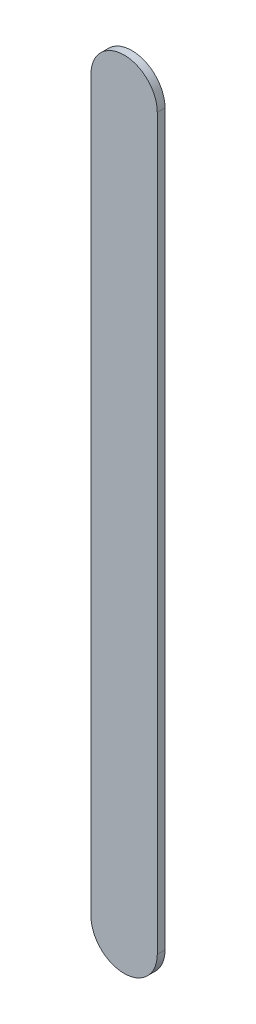
ISO-10303-21;
HEADER;
FILE_DESCRIPTION(('STEP AP214'),'2;1');
FILE_NAME('part.step','',(''),(''),'','','');
FILE_SCHEMA(('AUTOMOTIVE_DESIGN { 1 0 10303 214 1 1 1 1 }'));
ENDSEC;
DATA;
#1=APPLICATION_CONTEXT('core data for automotive mechanical design processes');
#2=APPLICATION_PROTOCOL_DEFINITION('international standard','automotive_design',2000,#1);
#3=PRODUCT_CONTEXT('',#1,'mechanical');
#4=PRODUCT('Part','Part','',(#3));
#5=PRODUCT_RELATED_PRODUCT_CATEGORY('part','',(#4));
#6=PRODUCT_DEFINITION_FORMATION('','',#4);
#7=PRODUCT_DEFINITION_CONTEXT('part definition',#1,'design');
#8=PRODUCT_DEFINITION('design','',#6,#7);
#9=PRODUCT_DEFINITION_SHAPE('','',#8);
#10=(LENGTH_UNIT() NAMED_UNIT(*) SI_UNIT(.MILLI.,.METRE.));
#11=(NAMED_UNIT(*) PLANE_ANGLE_UNIT() SI_UNIT($,.RADIAN.));
#12=(NAMED_UNIT(*) SI_UNIT($,.STERADIAN.) SOLID_ANGLE_UNIT());
#13=UNCERTAINTY_MEASURE_WITH_UNIT(LENGTH_MEASURE(1.E-05),#10,'distance_accuracy_value','');
#14=(GEOMETRIC_REPRESENTATION_CONTEXT(3) GLOBAL_UNCERTAINTY_ASSIGNED_CONTEXT((#13)) GLOBAL_UNIT_ASSIGNED_CONTEXT((#10,
#11,#12)) REPRESENTATION_CONTEXT('',''));
#15=CARTESIAN_POINT('',(0.,0.,0.));
#16=DIRECTION('',(0.,0.,1.));
#17=DIRECTION('',(1.,0.,0.));
#18=AXIS2_PLACEMENT_3D('',#15,#16,#17);
#19=CARTESIAN_POINT('',(96.15,-131.5,1.635));
#20=DIRECTION('',(0.,0.,1.));
#21=DIRECTION('',(1.,0.,0.));
#22=AXIS2_PLACEMENT_3D('',#19,#20,#21);
#23=PLANE('',#22);
#24=DIRECTION('',(0.,-1.,0.));
#25=VECTOR('',#24,1.);
#26=CARTESIAN_POINT('',(96.15,-131.5,1.635));
#27=LINE('',#26,#25);
#28=CARTESIAN_POINT('',(96.15,-131.5,1.635));
#29=VERTEX_POINT('',#28);
#30=CARTESIAN_POINT('',(96.15,-134.8,1.635));
#31=VERTEX_POINT('',#30);
#32=EDGE_CURVE('E92',#29,#31,#27,.T.);
#33=ORIENTED_EDGE('',*,*,#32,.T.);
#34=CARTESIAN_POINT('',(96.3,-134.8,1.635));
#35=DIRECTION('',(0.,0.,1.));
#36=DIRECTION('',(-1.,-1.894780628694E-13,0.));
#37=AXIS2_PLACEMENT_3D('',#34,#35,#36);
#38=CIRCLE('',#37,0.15);
#39=CARTESIAN_POINT('',(96.45,-134.8,1.635));
#40=VERTEX_POINT('',#39);
#41=EDGE_CURVE('E104',#31,#40,#38,.T.);
#42=ORIENTED_EDGE('',*,*,#41,.T.);
#43=DIRECTION('',(0.,1.,0.));
#44=VECTOR('',#43,1.);
#45=CARTESIAN_POINT('',(96.45,-134.8,1.635));
#46=LINE('',#45,#44);
#47=CARTESIAN_POINT('',(96.45,-131.5,1.635));
#48=VERTEX_POINT('',#47);
#49=EDGE_CURVE('E85',#40,#48,#46,.T.);
#50=ORIENTED_EDGE('',*,*,#49,.T.);
#51=CARTESIAN_POINT('',(96.3,-131.5,1.635));
#52=DIRECTION('',(0.,0.,1.));
#53=DIRECTION('',(1.,0.,0.));
#54=AXIS2_PLACEMENT_3D('',#51,#52,#53);
#55=CIRCLE('',#54,0.15);
#56=EDGE_CURVE('E11',#48,#29,#55,.T.);
#57=ORIENTED_EDGE('',*,*,#56,.T.);
#58=EDGE_LOOP('',(#33,#42,#50,#57));
#59=FACE_BOUND('',#58,.T.);
#60=ADVANCED_FACE('F17',(#59),#23,.T.);
#61=CARTESIAN_POINT('',(96.15,-131.5,1.6));
#62=DIRECTION('',(0.,0.,1.));
#63=DIRECTION('',(1.,0.,0.));
#64=AXIS2_PLACEMENT_3D('',#61,#62,#63);
#65=PLANE('',#64);
#66=CARTESIAN_POINT('',(96.3,-131.5,1.6));
#67=DIRECTION('',(0.,0.,1.));
#68=DIRECTION('',(1.,0.,0.));
#69=AXIS2_PLACEMENT_3D('',#66,#67,#68);
#70=CIRCLE('',#69,0.15);
#71=CARTESIAN_POINT('',(96.45,-131.5,1.6));
#72=VERTEX_POINT('',#71);
#73=CARTESIAN_POINT('',(96.15,-131.5,1.6));
#74=VERTEX_POINT('',#73);
#75=EDGE_CURVE('E26',#72,#74,#70,.T.);
#76=ORIENTED_EDGE('',*,*,#75,.F.);
#77=DIRECTION('',(0.,1.,0.));
#78=VECTOR('',#77,1.);
#79=CARTESIAN_POINT('',(96.45,-134.8,1.6));
#80=LINE('',#79,#78);
#81=CARTESIAN_POINT('',(96.45,-134.8,1.6));
#82=VERTEX_POINT('',#81);
#83=EDGE_CURVE('E59',#82,#72,#80,.T.);
#84=ORIENTED_EDGE('',*,*,#83,.F.);
#85=CARTESIAN_POINT('',(96.3,-134.8,1.6));
#86=DIRECTION('',(0.,0.,1.));
#87=DIRECTION('',(-1.,-1.894780628694E-13,0.));
#88=AXIS2_PLACEMENT_3D('',#85,#86,#87);
#89=CIRCLE('',#88,0.15);
#90=CARTESIAN_POINT('',(96.15,-134.8,1.6));
#91=VERTEX_POINT('',#90);
#92=EDGE_CURVE('E74',#91,#82,#89,.T.);
#93=ORIENTED_EDGE('',*,*,#92,.F.);
#94=DIRECTION('',(0.,-1.,0.));
#95=VECTOR('',#94,1.);
#96=CARTESIAN_POINT('',(96.15,-131.5,1.6));
#97=LINE('',#96,#95);
#98=EDGE_CURVE('E91',#74,#91,#97,.T.);
#99=ORIENTED_EDGE('',*,*,#98,.F.);
#100=EDGE_LOOP('',(#76,#84,#93,#99));
#101=FACE_BOUND('',#100,.T.);
#102=ADVANCED_FACE('F19',(#101),#65,.F.);
#103=CARTESIAN_POINT('',(96.3,-131.5,1.6));
#104=DIRECTION('',(0.,0.,-1.));
#105=DIRECTION('',(1.,0.,0.));
#106=AXIS2_PLACEMENT_3D('',#103,#104,#105);
#107=CYLINDRICAL_SURFACE('',#106,0.15);
#108=ORIENTED_EDGE('',*,*,#75,.T.);
#109=DIRECTION('',(0.,0.,1.));
#110=VECTOR('',#109,1.);
#111=CARTESIAN_POINT('',(96.15,-131.5,1.6));
#112=LINE('',#111,#110);
#113=EDGE_CURVE('E80',#74,#29,#112,.T.);
#114=ORIENTED_EDGE('',*,*,#113,.T.);
#115=ORIENTED_EDGE('',*,*,#56,.F.);
#116=DIRECTION('',(0.,0.,1.));
#117=VECTOR('',#116,1.);
#118=CARTESIAN_POINT('',(96.45,-131.5,1.6));
#119=LINE('',#118,#117);
#120=EDGE_CURVE('E83',#72,#48,#119,.T.);
#121=ORIENTED_EDGE('',*,*,#120,.F.);
#122=EDGE_LOOP('',(#108,#114,#115,#121));
#123=FACE_BOUND('',#122,.T.);
#124=ADVANCED_FACE('F79',(#123),#107,.T.);
#125=CARTESIAN_POINT('',(96.45,-134.8,1.6));
#126=DIRECTION('',(-1.,0.,0.));
#127=DIRECTION('',(0.,0.,1.));
#128=AXIS2_PLACEMENT_3D('',#125,#126,#127);
#129=PLANE('',#128);
#130=ORIENTED_EDGE('',*,*,#83,.T.);
#131=ORIENTED_EDGE('',*,*,#120,.T.);
#132=ORIENTED_EDGE('',*,*,#49,.F.);
#133=DIRECTION('',(0.,0.,1.));
#134=VECTOR('',#133,1.);
#135=CARTESIAN_POINT('',(96.45,-134.8,1.6));
#136=LINE('',#135,#134);
#137=EDGE_CURVE('E111',#82,#40,#136,.T.);
#138=ORIENTED_EDGE('',*,*,#137,.F.);
#139=EDGE_LOOP('',(#130,#131,#132,#138));
#140=FACE_BOUND('',#139,.T.);
#141=ADVANCED_FACE('F122',(#140),#129,.F.);
#142=CARTESIAN_POINT('',(96.3,-134.8,1.6));
#143=DIRECTION('',(0.,0.,-1.));
#144=DIRECTION('',(-1.,-1.894780628694E-13,0.));
#145=AXIS2_PLACEMENT_3D('',#142,#143,#144);
#146=CYLINDRICAL_SURFACE('',#145,0.15);
#147=ORIENTED_EDGE('',*,*,#92,.T.);
#148=ORIENTED_EDGE('',*,*,#137,.T.);
#149=ORIENTED_EDGE('',*,*,#41,.F.);
#150=DIRECTION('',(0.,0.,1.));
#151=VECTOR('',#150,1.);
#152=CARTESIAN_POINT('',(96.15,-134.8,1.6));
#153=LINE('',#152,#151);
#154=EDGE_CURVE('E96',#91,#31,#153,.T.);
#155=ORIENTED_EDGE('',*,*,#154,.F.);
#156=EDGE_LOOP('',(#147,#148,#149,#155));
#157=FACE_BOUND('',#156,.T.);
#158=ADVANCED_FACE('F124',(#157),#146,.T.);
#159=CARTESIAN_POINT('',(96.15,-131.5,1.6));
#160=DIRECTION('',(1.,0.,0.));
#161=DIRECTION('',(0.,1.,0.));
#162=AXIS2_PLACEMENT_3D('',#159,#160,#161);
#163=PLANE('',#162);
#164=ORIENTED_EDGE('',*,*,#98,.T.);
#165=ORIENTED_EDGE('',*,*,#154,.T.);
#166=ORIENTED_EDGE('',*,*,#32,.F.);
#167=ORIENTED_EDGE('',*,*,#113,.F.);
#168=EDGE_LOOP('',(#164,#165,#166,#167));
#169=FACE_BOUND('',#168,.T.);
#170=ADVANCED_FACE('F89',(#169),#163,.F.);
#171=CLOSED_SHELL('',(#60,#102,#124,#141,#158,#170));
#172=MANIFOLD_SOLID_BREP('B1',#171);
#173=ADVANCED_BREP_SHAPE_REPRESENTATION('',(#18,#172),#14);
#174=SHAPE_DEFINITION_REPRESENTATION(#9,#173);
ENDSEC;
END-ISO-10303-21;
